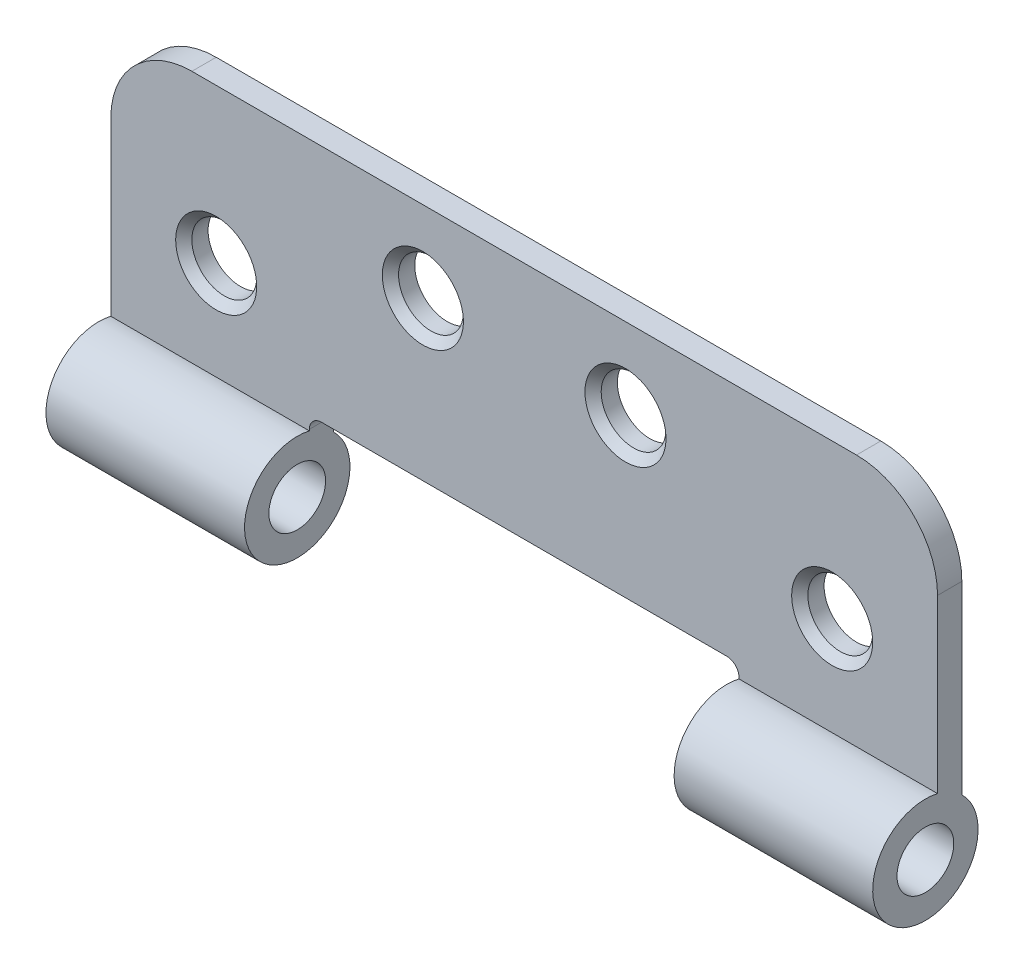
ISO-10303-21;
HEADER;
FILE_DESCRIPTION(('STEP AP214'),'2;1');
FILE_NAME('part.step','',(''),(''),'','','');
FILE_SCHEMA(('AUTOMOTIVE_DESIGN { 1 0 10303 214 1 1 1 1 }'));
ENDSEC;
DATA;
#1=APPLICATION_CONTEXT('core data for automotive mechanical design processes');
#2=APPLICATION_PROTOCOL_DEFINITION('international standard','automotive_design',2000,#1);
#3=PRODUCT_CONTEXT('',#1,'mechanical');
#4=PRODUCT('Part','Part','',(#3));
#5=PRODUCT_RELATED_PRODUCT_CATEGORY('part','',(#4));
#6=PRODUCT_DEFINITION_FORMATION('','',#4);
#7=PRODUCT_DEFINITION_CONTEXT('part definition',#1,'design');
#8=PRODUCT_DEFINITION('design','',#6,#7);
#9=PRODUCT_DEFINITION_SHAPE('','',#8);
#10=(LENGTH_UNIT() NAMED_UNIT(*) SI_UNIT(.MILLI.,.METRE.));
#11=(NAMED_UNIT(*) PLANE_ANGLE_UNIT() SI_UNIT($,.RADIAN.));
#12=(NAMED_UNIT(*) SI_UNIT($,.STERADIAN.) SOLID_ANGLE_UNIT());
#13=UNCERTAINTY_MEASURE_WITH_UNIT(LENGTH_MEASURE(1.E-05),#10,'distance_accuracy_value','');
#14=(GEOMETRIC_REPRESENTATION_CONTEXT(3) GLOBAL_UNCERTAINTY_ASSIGNED_CONTEXT((#13)) GLOBAL_UNIT_ASSIGNED_CONTEXT((#10,
#11,#12)) REPRESENTATION_CONTEXT('',''));
#15=CARTESIAN_POINT('',(0.,0.,0.));
#16=DIRECTION('',(0.,0.,1.));
#17=DIRECTION('',(1.,0.,0.));
#18=AXIS2_PLACEMENT_3D('',#15,#16,#17);
#19=CARTESIAN_POINT('',(69.3847763108502,0.,4.5));
#20=DIRECTION('',(-1.,0.,0.));
#21=DIRECTION('',(0.,0.,1.));
#22=AXIS2_PLACEMENT_3D('',#19,#20,#21);
#23=CYLINDRICAL_SURFACE('',#22,6.5);
#24=CARTESIAN_POINT('',(-26.5,0.,4.5));
#25=DIRECTION('',(-1.,0.,0.));
#26=DIRECTION('',(0.,-1.,0.));
#27=AXIS2_PLACEMENT_3D('',#24,#25,#26);
#28=CIRCLE('',#27,6.5);
#29=CARTESIAN_POINT('',(-26.5,6.32455532033676,3.));
#30=VERTEX_POINT('',#29);
#31=CARTESIAN_POINT('',(-26.5,4.69041575982343,0.));
#32=VERTEX_POINT('',#31);
#33=EDGE_CURVE('E529',#30,#32,#28,.F.);
#34=ORIENTED_EDGE('',*,*,#33,.F.);
#35=DIRECTION('',(-1.,0.,0.));
#36=VECTOR('',#35,1.);
#37=CARTESIAN_POINT('',(69.3847763108502,6.32455532033676,3.));
#38=LINE('',#37,#36);
#39=CARTESIAN_POINT('',(-51.,6.32455532033676,3.));
#40=VERTEX_POINT('',#39);
#41=EDGE_CURVE('E157',#40,#30,#38,.F.);
#42=ORIENTED_EDGE('',*,*,#41,.F.);
#43=CARTESIAN_POINT('',(-51.,0.,4.5));
#44=DIRECTION('',(-1.,0.,0.));
#45=DIRECTION('',(0.,0.,1.));
#46=AXIS2_PLACEMENT_3D('',#43,#44,#45);
#47=CIRCLE('',#46,6.5);
#48=CARTESIAN_POINT('',(-51.,4.69041575982343,0.));
#49=VERTEX_POINT('',#48);
#50=EDGE_CURVE('E541',#49,#40,#47,.T.);
#51=ORIENTED_EDGE('',*,*,#50,.F.);
#52=DIRECTION('',(-1.,0.,0.));
#53=VECTOR('',#52,1.);
#54=CARTESIAN_POINT('',(69.3847763108502,4.69041575982343,0.));
#55=LINE('',#54,#53);
#56=EDGE_CURVE('E158',#49,#32,#55,.F.);
#57=ORIENTED_EDGE('',*,*,#56,.T.);
#58=EDGE_LOOP('',(#34,#42,#51,#57));
#59=FACE_BOUND('',#58,.T.);
#60=ADVANCED_FACE('F40',(#59),#23,.T.);
#61=CARTESIAN_POINT('',(51.,0.,4.5));
#62=DIRECTION('',(-1.,0.,0.));
#63=DIRECTION('',(0.,0.,1.));
#64=AXIS2_PLACEMENT_3D('',#61,#62,#63);
#65=CYLINDRICAL_SURFACE('',#64,3.5);
#66=CARTESIAN_POINT('',(-26.5,0.,4.5));
#67=DIRECTION('',(-1.,0.,0.));
#68=DIRECTION('',(0.,-1.,0.));
#69=AXIS2_PLACEMENT_3D('',#66,#67,#68);
#70=CIRCLE('',#69,3.5);
#71=CARTESIAN_POINT('',(-26.5,-3.5,4.5));
#72=VERTEX_POINT('',#71);
#73=EDGE_CURVE('E143',#72,#72,#70,.F.);
#74=ORIENTED_EDGE('',*,*,#73,.T.);
#75=EDGE_LOOP('',(#74));
#76=FACE_BOUND('',#75,.T.);
#77=CARTESIAN_POINT('',(-51.,0.,4.5));
#78=DIRECTION('',(-1.,0.,0.));
#79=DIRECTION('',(0.,0.,1.));
#80=AXIS2_PLACEMENT_3D('',#77,#78,#79);
#81=CIRCLE('',#80,3.5);
#82=CARTESIAN_POINT('',(-51.,0.,8.));
#83=VERTEX_POINT('',#82);
#84=EDGE_CURVE('E537',#83,#83,#81,.T.);
#85=ORIENTED_EDGE('',*,*,#84,.T.);
#86=EDGE_LOOP('',(#85));
#87=FACE_BOUND('',#86,.T.);
#88=ADVANCED_FACE('F272',(#76,#87),#65,.F.);
#89=CARTESIAN_POINT('',(-41.,27.5,3.));
#90=DIRECTION('',(0.,0.,-1.));
#91=DIRECTION('',(-1.,0.,0.));
#92=AXIS2_PLACEMENT_3D('',#89,#90,#91);
#93=PLANE('',#92);
#94=CARTESIAN_POINT('',(38.,18.5,3.));
#95=DIRECTION('',(0.,0.,-1.));
#96=DIRECTION('',(-1.,0.,0.));
#97=AXIS2_PLACEMENT_3D('',#94,#95,#96);
#98=CIRCLE('',#97,5.00000000000003);
#99=CARTESIAN_POINT('',(33.,18.5,3.));
#100=VERTEX_POINT('',#99);
#101=EDGE_CURVE('E246',#100,#100,#98,.T.);
#102=ORIENTED_EDGE('',*,*,#101,.T.);
#103=EDGE_LOOP('',(#102));
#104=FACE_BOUND('',#103,.T.);
#105=CARTESIAN_POINT('',(12.5,27.5,3.));
#106=DIRECTION('',(0.,0.,-1.));
#107=DIRECTION('',(-1.,0.,0.));
#108=AXIS2_PLACEMENT_3D('',#105,#106,#107);
#109=CIRCLE('',#108,5.00000000000002);
#110=CARTESIAN_POINT('',(7.49999999999999,27.5,3.));
#111=VERTEX_POINT('',#110);
#112=EDGE_CURVE('E243',#111,#111,#109,.T.);
#113=ORIENTED_EDGE('',*,*,#112,.T.);
#114=EDGE_LOOP('',(#113));
#115=FACE_BOUND('',#114,.T.);
#116=CARTESIAN_POINT('',(-12.5,27.5,3.));
#117=DIRECTION('',(0.,0.,-1.));
#118=DIRECTION('',(-1.,0.,0.));
#119=AXIS2_PLACEMENT_3D('',#116,#117,#118);
#120=CIRCLE('',#119,5.00000000000003);
#121=CARTESIAN_POINT('',(-17.5,27.5,3.));
#122=VERTEX_POINT('',#121);
#123=EDGE_CURVE('E240',#122,#122,#120,.T.);
#124=ORIENTED_EDGE('',*,*,#123,.T.);
#125=EDGE_LOOP('',(#124));
#126=FACE_BOUND('',#125,.T.);
#127=CARTESIAN_POINT('',(-38.,18.5,3.));
#128=DIRECTION('',(0.,0.,-1.));
#129=DIRECTION('',(-1.,0.,0.));
#130=AXIS2_PLACEMENT_3D('',#127,#128,#129);
#131=CIRCLE('',#130,5.00000000000002);
#132=CARTESIAN_POINT('',(-43.,18.5,3.));
#133=VERTEX_POINT('',#132);
#134=EDGE_CURVE('E237',#133,#133,#131,.T.);
#135=ORIENTED_EDGE('',*,*,#134,.T.);
#136=EDGE_LOOP('',(#135));
#137=FACE_BOUND('',#136,.T.);
#138=ORIENTED_EDGE('',*,*,#41,.T.);
#139=DIRECTION('',(0.,1.,0.));
#140=VECTOR('',#139,1.);
#141=CARTESIAN_POINT('',(-26.5,27.5,3.));
#142=LINE('',#141,#140);
#143=CARTESIAN_POINT('',(-26.5,6.5,3.));
#144=VERTEX_POINT('',#143);
#145=EDGE_CURVE('E217',#30,#144,#142,.T.);
#146=ORIENTED_EDGE('',*,*,#145,.T.);
#147=CARTESIAN_POINT('',(-25.,6.5,3.));
#148=DIRECTION('',(0.,0.,-1.));
#149=DIRECTION('',(-1.,0.,0.));
#150=AXIS2_PLACEMENT_3D('',#147,#148,#149);
#151=CIRCLE('',#150,1.5);
#152=CARTESIAN_POINT('',(-25.,8.,3.));
#153=VERTEX_POINT('',#152);
#154=EDGE_CURVE('E56',#144,#153,#151,.T.);
#155=ORIENTED_EDGE('',*,*,#154,.T.);
#156=DIRECTION('',(1.,0.,0.));
#157=VECTOR('',#156,1.);
#158=CARTESIAN_POINT('',(-41.,8.,3.));
#159=LINE('',#158,#157);
#160=CARTESIAN_POINT('',(25.,8.,3.));
#161=VERTEX_POINT('',#160);
#162=EDGE_CURVE('E535',#153,#161,#159,.T.);
#163=ORIENTED_EDGE('',*,*,#162,.T.);
#164=CARTESIAN_POINT('',(25.,6.5,3.));
#165=DIRECTION('',(0.,0.,-1.));
#166=DIRECTION('',(-1.,0.,0.));
#167=AXIS2_PLACEMENT_3D('',#164,#165,#166);
#168=CIRCLE('',#167,1.5);
#169=CARTESIAN_POINT('',(26.5,6.5,3.));
#170=VERTEX_POINT('',#169);
#171=EDGE_CURVE('E140',#161,#170,#168,.T.);
#172=ORIENTED_EDGE('',*,*,#171,.T.);
#173=DIRECTION('',(0.,-1.,0.));
#174=VECTOR('',#173,1.);
#175=CARTESIAN_POINT('',(26.5,27.5,3.));
#176=LINE('',#175,#174);
#177=CARTESIAN_POINT('',(26.5,6.32455532033676,3.));
#178=VERTEX_POINT('',#177);
#179=EDGE_CURVE('E132',#170,#178,#176,.T.);
#180=ORIENTED_EDGE('',*,*,#179,.T.);
#181=CARTESIAN_POINT('',(51.,6.32455532033676,3.));
#182=VERTEX_POINT('',#181);
#183=EDGE_CURVE('E137',#178,#182,#38,.F.);
#184=ORIENTED_EDGE('',*,*,#183,.T.);
#185=DIRECTION('',(0.,1.,0.));
#186=VECTOR('',#185,1.);
#187=CARTESIAN_POINT('',(51.,0.,3.));
#188=LINE('',#187,#186);
#189=CARTESIAN_POINT('',(51.,27.4999999999999,3.));
#190=VERTEX_POINT('',#189);
#191=EDGE_CURVE('E181',#182,#190,#188,.T.);
#192=ORIENTED_EDGE('',*,*,#191,.T.);
#193=CARTESIAN_POINT('',(41.,27.5,3.));
#194=DIRECTION('',(0.,0.,1.));
#195=DIRECTION('',(-1.,0.,0.));
#196=AXIS2_PLACEMENT_3D('',#193,#194,#195);
#197=CIRCLE('',#196,10.);
#198=CARTESIAN_POINT('',(40.9999999999999,37.5,3.));
#199=VERTEX_POINT('',#198);
#200=EDGE_CURVE('E184',#190,#199,#197,.T.);
#201=ORIENTED_EDGE('',*,*,#200,.T.);
#202=DIRECTION('',(-1.,0.,0.));
#203=VECTOR('',#202,1.);
#204=CARTESIAN_POINT('',(-40.9999999999999,37.5,3.));
#205=LINE('',#204,#203);
#206=CARTESIAN_POINT('',(-40.9999999999999,37.5,3.));
#207=VERTEX_POINT('',#206);
#208=EDGE_CURVE('E186',#199,#207,#205,.T.);
#209=ORIENTED_EDGE('',*,*,#208,.T.);
#210=CARTESIAN_POINT('',(-41.,27.5,3.));
#211=DIRECTION('',(0.,0.,1.));
#212=DIRECTION('',(-1.,0.,0.));
#213=AXIS2_PLACEMENT_3D('',#210,#211,#212);
#214=CIRCLE('',#213,10.);
#215=CARTESIAN_POINT('',(-51.,27.4999999999999,3.));
#216=VERTEX_POINT('',#215);
#217=EDGE_CURVE('E188',#207,#216,#214,.T.);
#218=ORIENTED_EDGE('',*,*,#217,.T.);
#219=DIRECTION('',(0.,-1.,0.));
#220=VECTOR('',#219,1.);
#221=CARTESIAN_POINT('',(-51.,0.,3.));
#222=LINE('',#221,#220);
#223=EDGE_CURVE('E178',#216,#40,#222,.T.);
#224=ORIENTED_EDGE('',*,*,#223,.T.);
#225=EDGE_LOOP('',(#138,#146,#155,#163,#172,#180,#184,#192,#201,#209,#218,#224));
#226=FACE_BOUND('',#225,.T.);
#227=ADVANCED_FACE('F135',(#104,#115,#126,#137,#226),#93,.F.);
#228=CARTESIAN_POINT('',(-41.,27.5,0.));
#229=DIRECTION('',(0.,0.,-1.));
#230=DIRECTION('',(-1.,0.,0.));
#231=AXIS2_PLACEMENT_3D('',#228,#229,#230);
#232=PLANE('',#231);
#233=DIRECTION('',(0.,1.,0.));
#234=VECTOR('',#233,1.);
#235=CARTESIAN_POINT('',(-26.5,27.5,0.));
#236=LINE('',#235,#234);
#237=CARTESIAN_POINT('',(-26.5,6.5,0.));
#238=VERTEX_POINT('',#237);
#239=EDGE_CURVE('E531',#32,#238,#236,.T.);
#240=ORIENTED_EDGE('',*,*,#239,.F.);
#241=ORIENTED_EDGE('',*,*,#56,.F.);
#242=DIRECTION('',(0.,-1.,0.));
#243=VECTOR('',#242,1.);
#244=CARTESIAN_POINT('',(-51.,0.,0.));
#245=LINE('',#244,#243);
#246=CARTESIAN_POINT('',(-51.,27.4999999999999,0.));
#247=VERTEX_POINT('',#246);
#248=EDGE_CURVE('E177',#247,#49,#245,.T.);
#249=ORIENTED_EDGE('',*,*,#248,.F.);
#250=CARTESIAN_POINT('',(-41.,27.5,0.));
#251=DIRECTION('',(0.,0.,1.));
#252=DIRECTION('',(-1.,0.,0.));
#253=AXIS2_PLACEMENT_3D('',#250,#251,#252);
#254=CIRCLE('',#253,10.);
#255=CARTESIAN_POINT('',(-40.9999999999999,37.5,0.));
#256=VERTEX_POINT('',#255);
#257=EDGE_CURVE('E182',#256,#247,#254,.T.);
#258=ORIENTED_EDGE('',*,*,#257,.F.);
#259=DIRECTION('',(-1.,0.,0.));
#260=VECTOR('',#259,1.);
#261=CARTESIAN_POINT('',(-40.9999999999999,37.5,0.));
#262=LINE('',#261,#260);
#263=CARTESIAN_POINT('',(40.9999999999999,37.5,0.));
#264=VERTEX_POINT('',#263);
#265=EDGE_CURVE('E197',#264,#256,#262,.T.);
#266=ORIENTED_EDGE('',*,*,#265,.F.);
#267=CARTESIAN_POINT('',(41.,27.5,0.));
#268=DIRECTION('',(0.,0.,1.));
#269=DIRECTION('',(-1.,0.,0.));
#270=AXIS2_PLACEMENT_3D('',#267,#268,#269);
#271=CIRCLE('',#270,10.);
#272=CARTESIAN_POINT('',(51.,27.4999999999999,0.));
#273=VERTEX_POINT('',#272);
#274=EDGE_CURVE('E195',#273,#264,#271,.T.);
#275=ORIENTED_EDGE('',*,*,#274,.F.);
#276=DIRECTION('',(0.,1.,0.));
#277=VECTOR('',#276,1.);
#278=CARTESIAN_POINT('',(51.,0.,0.));
#279=LINE('',#278,#277);
#280=CARTESIAN_POINT('',(51.,4.69041575982343,0.));
#281=VERTEX_POINT('',#280);
#282=EDGE_CURVE('E193',#281,#273,#279,.T.);
#283=ORIENTED_EDGE('',*,*,#282,.F.);
#284=CARTESIAN_POINT('',(26.5,4.69041575982343,0.));
#285=VERTEX_POINT('',#284);
#286=EDGE_CURVE('E162',#285,#281,#55,.F.);
#287=ORIENTED_EDGE('',*,*,#286,.F.);
#288=DIRECTION('',(0.,-1.,0.));
#289=VECTOR('',#288,1.);
#290=CARTESIAN_POINT('',(26.5,27.5,0.));
#291=LINE('',#290,#289);
#292=CARTESIAN_POINT('',(26.5,6.5,0.));
#293=VERTEX_POINT('',#292);
#294=EDGE_CURVE('E149',#293,#285,#291,.T.);
#295=ORIENTED_EDGE('',*,*,#294,.F.);
#296=CARTESIAN_POINT('',(25.,6.5,0.));
#297=DIRECTION('',(0.,0.,-1.));
#298=DIRECTION('',(-1.,0.,0.));
#299=AXIS2_PLACEMENT_3D('',#296,#297,#298);
#300=CIRCLE('',#299,1.5);
#301=CARTESIAN_POINT('',(25.,8.,0.));
#302=VERTEX_POINT('',#301);
#303=EDGE_CURVE('E230',#293,#302,#300,.F.);
#304=ORIENTED_EDGE('',*,*,#303,.T.);
#305=DIRECTION('',(1.,0.,0.));
#306=VECTOR('',#305,1.);
#307=CARTESIAN_POINT('',(-41.,8.,0.));
#308=LINE('',#307,#306);
#309=CARTESIAN_POINT('',(-25.,8.,0.));
#310=VERTEX_POINT('',#309);
#311=EDGE_CURVE('E211',#310,#302,#308,.T.);
#312=ORIENTED_EDGE('',*,*,#311,.F.);
#313=CARTESIAN_POINT('',(-25.,6.5,0.));
#314=DIRECTION('',(0.,0.,-1.));
#315=DIRECTION('',(-1.,0.,0.));
#316=AXIS2_PLACEMENT_3D('',#313,#314,#315);
#317=CIRCLE('',#316,1.5);
#318=EDGE_CURVE('E64',#310,#238,#317,.F.);
#319=ORIENTED_EDGE('',*,*,#318,.T.);
#320=EDGE_LOOP('',(#240,#241,#249,#258,#266,#275,#283,#287,#295,#304,#312,#319));
#321=FACE_BOUND('',#320,.T.);
#322=CARTESIAN_POINT('',(-12.5,27.5,0.));
#323=DIRECTION('',(0.,0.,1.));
#324=DIRECTION('',(1.,0.,0.));
#325=AXIS2_PLACEMENT_3D('',#322,#323,#324);
#326=CIRCLE('',#325,4.);
#327=CARTESIAN_POINT('',(-8.49999999999999,27.5,0.));
#328=VERTEX_POINT('',#327);
#329=EDGE_CURVE('E168',#328,#328,#326,.T.);
#330=ORIENTED_EDGE('',*,*,#329,.T.);
#331=EDGE_LOOP('',(#330));
#332=FACE_BOUND('',#331,.T.);
#333=CARTESIAN_POINT('',(-38.,18.5,0.));
#334=DIRECTION('',(0.,0.,1.));
#335=DIRECTION('',(1.,0.,0.));
#336=AXIS2_PLACEMENT_3D('',#333,#334,#335);
#337=CIRCLE('',#336,4.00000000000001);
#338=CARTESIAN_POINT('',(-34.,18.5,0.));
#339=VERTEX_POINT('',#338);
#340=EDGE_CURVE('E174',#339,#339,#337,.T.);
#341=ORIENTED_EDGE('',*,*,#340,.T.);
#342=EDGE_LOOP('',(#341));
#343=FACE_BOUND('',#342,.T.);
#344=CARTESIAN_POINT('',(38.,18.5,0.));
#345=DIRECTION('',(0.,0.,1.));
#346=DIRECTION('',(1.,0.,0.));
#347=AXIS2_PLACEMENT_3D('',#344,#345,#346);
#348=CIRCLE('',#347,4.00000000000001);
#349=CARTESIAN_POINT('',(42.,18.5,0.));
#350=VERTEX_POINT('',#349);
#351=EDGE_CURVE('E171',#350,#350,#348,.T.);
#352=ORIENTED_EDGE('',*,*,#351,.T.);
#353=EDGE_LOOP('',(#352));
#354=FACE_BOUND('',#353,.T.);
#355=CARTESIAN_POINT('',(12.5,27.5,0.));
#356=DIRECTION('',(0.,0.,1.));
#357=DIRECTION('',(1.,0.,0.));
#358=AXIS2_PLACEMENT_3D('',#355,#356,#357);
#359=CIRCLE('',#358,4.);
#360=CARTESIAN_POINT('',(16.5,27.5,0.));
#361=VERTEX_POINT('',#360);
#362=EDGE_CURVE('E160',#361,#361,#359,.T.);
#363=ORIENTED_EDGE('',*,*,#362,.T.);
#364=EDGE_LOOP('',(#363));
#365=FACE_BOUND('',#364,.T.);
#366=ADVANCED_FACE('F308',(#321,#332,#343,#354,#365),#232,.T.);
#367=CARTESIAN_POINT('',(-51.,0.,3.));
#368=DIRECTION('',(1.,0.,0.));
#369=DIRECTION('',(0.,0.,-1.));
#370=AXIS2_PLACEMENT_3D('',#367,#368,#369);
#371=PLANE('',#370);
#372=ORIENTED_EDGE('',*,*,#84,.F.);
#373=EDGE_LOOP('',(#372));
#374=FACE_BOUND('',#373,.T.);
#375=ORIENTED_EDGE('',*,*,#50,.T.);
#376=ORIENTED_EDGE('',*,*,#223,.F.);
#377=DIRECTION('',(0.,0.,-1.));
#378=VECTOR('',#377,1.);
#379=CARTESIAN_POINT('',(-51.,27.4999999999999,3.));
#380=LINE('',#379,#378);
#381=EDGE_CURVE('E190',#216,#247,#380,.T.);
#382=ORIENTED_EDGE('',*,*,#381,.T.);
#383=ORIENTED_EDGE('',*,*,#248,.T.);
#384=EDGE_LOOP('',(#375,#376,#382,#383));
#385=FACE_BOUND('',#384,.T.);
#386=ADVANCED_FACE('F312',(#374,#385),#371,.F.);
#387=CARTESIAN_POINT('',(51.,0.,3.));
#388=DIRECTION('',(-1.,0.,0.));
#389=DIRECTION('',(0.,0.,1.));
#390=AXIS2_PLACEMENT_3D('',#387,#388,#389);
#391=PLANE('',#390);
#392=CARTESIAN_POINT('',(51.,0.,4.5));
#393=DIRECTION('',(-1.,0.,0.));
#394=DIRECTION('',(0.,0.,1.));
#395=AXIS2_PLACEMENT_3D('',#392,#393,#394);
#396=CIRCLE('',#395,3.5);
#397=CARTESIAN_POINT('',(51.,0.,8.));
#398=VERTEX_POINT('',#397);
#399=EDGE_CURVE('E538',#398,#398,#396,.T.);
#400=ORIENTED_EDGE('',*,*,#399,.T.);
#401=EDGE_LOOP('',(#400));
#402=FACE_BOUND('',#401,.T.);
#403=ORIENTED_EDGE('',*,*,#191,.F.);
#404=CARTESIAN_POINT('',(51.,0.,4.5));
#405=DIRECTION('',(-1.,0.,0.));
#406=DIRECTION('',(0.,0.,1.));
#407=AXIS2_PLACEMENT_3D('',#404,#405,#406);
#408=CIRCLE('',#407,6.5);
#409=EDGE_CURVE('E155',#182,#281,#408,.F.);
#410=ORIENTED_EDGE('',*,*,#409,.T.);
#411=ORIENTED_EDGE('',*,*,#282,.T.);
#412=DIRECTION('',(0.,0.,-1.));
#413=VECTOR('',#412,1.);
#414=CARTESIAN_POINT('',(51.,27.4999999999999,3.));
#415=LINE('',#414,#413);
#416=EDGE_CURVE('E208',#190,#273,#415,.T.);
#417=ORIENTED_EDGE('',*,*,#416,.F.);
#418=EDGE_LOOP('',(#403,#410,#411,#417));
#419=FACE_BOUND('',#418,.T.);
#420=ADVANCED_FACE('F323',(#402,#419),#391,.F.);
#421=CARTESIAN_POINT('',(41.,27.5,3.));
#422=DIRECTION('',(0.,0.,-1.));
#423=DIRECTION('',(-1.,0.,0.));
#424=AXIS2_PLACEMENT_3D('',#421,#422,#423);
#425=CYLINDRICAL_SURFACE('',#424,10.);
#426=ORIENTED_EDGE('',*,*,#274,.T.);
#427=DIRECTION('',(0.,0.,-1.));
#428=VECTOR('',#427,1.);
#429=CARTESIAN_POINT('',(40.9999999999999,37.5,3.));
#430=LINE('',#429,#428);
#431=EDGE_CURVE('E205',#199,#264,#430,.T.);
#432=ORIENTED_EDGE('',*,*,#431,.F.);
#433=ORIENTED_EDGE('',*,*,#200,.F.);
#434=ORIENTED_EDGE('',*,*,#416,.T.);
#435=EDGE_LOOP('',(#426,#432,#433,#434));
#436=FACE_BOUND('',#435,.T.);
#437=ADVANCED_FACE('F319',(#436),#425,.T.);
#438=CARTESIAN_POINT('',(-40.9999999999999,37.5,3.));
#439=DIRECTION('',(0.,-1.,0.));
#440=DIRECTION('',(0.,0.,-1.));
#441=AXIS2_PLACEMENT_3D('',#438,#439,#440);
#442=PLANE('',#441);
#443=ORIENTED_EDGE('',*,*,#265,.T.);
#444=DIRECTION('',(0.,0.,-1.));
#445=VECTOR('',#444,1.);
#446=CARTESIAN_POINT('',(-40.9999999999999,37.5,3.));
#447=LINE('',#446,#445);
#448=EDGE_CURVE('E202',#207,#256,#447,.T.);
#449=ORIENTED_EDGE('',*,*,#448,.F.);
#450=ORIENTED_EDGE('',*,*,#208,.F.);
#451=ORIENTED_EDGE('',*,*,#431,.T.);
#452=EDGE_LOOP('',(#443,#449,#450,#451));
#453=FACE_BOUND('',#452,.T.);
#454=ADVANCED_FACE('F315',(#453),#442,.F.);
#455=CARTESIAN_POINT('',(-41.,27.5,3.));
#456=DIRECTION('',(0.,0.,-1.));
#457=DIRECTION('',(-1.,0.,0.));
#458=AXIS2_PLACEMENT_3D('',#455,#456,#457);
#459=CYLINDRICAL_SURFACE('',#458,10.);
#460=ORIENTED_EDGE('',*,*,#257,.T.);
#461=ORIENTED_EDGE('',*,*,#381,.F.);
#462=ORIENTED_EDGE('',*,*,#217,.F.);
#463=ORIENTED_EDGE('',*,*,#448,.T.);
#464=EDGE_LOOP('',(#460,#461,#462,#463));
#465=FACE_BOUND('',#464,.T.);
#466=ADVANCED_FACE('F304',(#465),#459,.T.);
#467=CARTESIAN_POINT('',(-38.,18.5,3.));
#468=DIRECTION('',(0.,0.,-1.));
#469=DIRECTION('',(-1.,0.,0.));
#470=AXIS2_PLACEMENT_3D('',#467,#468,#469);
#471=CYLINDRICAL_SURFACE('',#470,4.00000000000001);
#472=CARTESIAN_POINT('',(-38.,18.5,2.));
#473=DIRECTION('',(0.,0.,-1.));
#474=DIRECTION('',(-1.,0.,0.));
#475=AXIS2_PLACEMENT_3D('',#472,#473,#474);
#476=CIRCLE('',#475,4.00000000000001);
#477=CARTESIAN_POINT('',(-42.,18.5,2.));
#478=VERTEX_POINT('',#477);
#479=EDGE_CURVE('E11',#478,#478,#476,.F.);
#480=ORIENTED_EDGE('',*,*,#479,.T.);
#481=EDGE_LOOP('',(#480));
#482=FACE_BOUND('',#481,.T.);
#483=ORIENTED_EDGE('',*,*,#340,.F.);
#484=EDGE_LOOP('',(#483));
#485=FACE_BOUND('',#484,.T.);
#486=ADVANCED_FACE('F300',(#482,#485),#471,.F.);
#487=CARTESIAN_POINT('',(38.,18.5,3.));
#488=DIRECTION('',(0.,0.,-1.));
#489=DIRECTION('',(-1.,0.,0.));
#490=AXIS2_PLACEMENT_3D('',#487,#488,#489);
#491=CYLINDRICAL_SURFACE('',#490,4.00000000000001);
#492=CARTESIAN_POINT('',(38.,18.5,1.99999999999999));
#493=DIRECTION('',(0.,0.,-1.));
#494=DIRECTION('',(-1.,0.,0.));
#495=AXIS2_PLACEMENT_3D('',#492,#493,#494);
#496=CIRCLE('',#495,4.00000000000001);
#497=CARTESIAN_POINT('',(34.,18.5,1.99999999999999));
#498=VERTEX_POINT('',#497);
#499=EDGE_CURVE('E234',#498,#498,#496,.F.);
#500=ORIENTED_EDGE('',*,*,#499,.T.);
#501=EDGE_LOOP('',(#500));
#502=FACE_BOUND('',#501,.T.);
#503=ORIENTED_EDGE('',*,*,#351,.F.);
#504=EDGE_LOOP('',(#503));
#505=FACE_BOUND('',#504,.T.);
#506=ADVANCED_FACE('F294',(#502,#505),#491,.F.);
#507=CARTESIAN_POINT('',(-12.5,27.5,3.));
#508=DIRECTION('',(0.,0.,-1.));
#509=DIRECTION('',(-1.,0.,0.));
#510=AXIS2_PLACEMENT_3D('',#507,#508,#509);
#511=CYLINDRICAL_SURFACE('',#510,4.);
#512=CARTESIAN_POINT('',(-12.5,27.5,1.99999999999998));
#513=DIRECTION('',(0.,0.,-1.));
#514=DIRECTION('',(-1.,0.,0.));
#515=AXIS2_PLACEMENT_3D('',#512,#513,#514);
#516=CIRCLE('',#515,4.);
#517=CARTESIAN_POINT('',(-16.5,27.5,1.99999999999998));
#518=VERTEX_POINT('',#517);
#519=EDGE_CURVE('E49',#518,#518,#516,.F.);
#520=ORIENTED_EDGE('',*,*,#519,.T.);
#521=EDGE_LOOP('',(#520));
#522=FACE_BOUND('',#521,.T.);
#523=ORIENTED_EDGE('',*,*,#329,.F.);
#524=EDGE_LOOP('',(#523));
#525=FACE_BOUND('',#524,.T.);
#526=ADVANCED_FACE('F254',(#522,#525),#511,.F.);
#527=CARTESIAN_POINT('',(12.5,27.5,3.));
#528=DIRECTION('',(0.,0.,-1.));
#529=DIRECTION('',(-1.,0.,0.));
#530=AXIS2_PLACEMENT_3D('',#527,#528,#529);
#531=CYLINDRICAL_SURFACE('',#530,4.);
#532=CARTESIAN_POINT('',(12.5,27.5,2.));
#533=DIRECTION('',(0.,0.,-1.));
#534=DIRECTION('',(-1.,0.,0.));
#535=AXIS2_PLACEMENT_3D('',#532,#533,#534);
#536=CIRCLE('',#535,4.);
#537=CARTESIAN_POINT('',(8.5,27.5,2.));
#538=VERTEX_POINT('',#537);
#539=EDGE_CURVE('E249',#538,#538,#536,.F.);
#540=ORIENTED_EDGE('',*,*,#539,.T.);
#541=EDGE_LOOP('',(#540));
#542=FACE_BOUND('',#541,.T.);
#543=ORIENTED_EDGE('',*,*,#362,.F.);
#544=EDGE_LOOP('',(#543));
#545=FACE_BOUND('',#544,.T.);
#546=ADVANCED_FACE('F283',(#542,#545),#531,.F.);
#547=CARTESIAN_POINT('',(26.5,0.,4.5));
#548=DIRECTION('',(1.,0.,0.));
#549=DIRECTION('',(0.,1.,0.));
#550=AXIS2_PLACEMENT_3D('',#547,#548,#549);
#551=CIRCLE('',#550,6.5);
#552=EDGE_CURVE('E144',#285,#178,#551,.F.);
#553=ORIENTED_EDGE('',*,*,#552,.F.);
#554=ORIENTED_EDGE('',*,*,#286,.T.);
#555=ORIENTED_EDGE('',*,*,#409,.F.);
#556=ORIENTED_EDGE('',*,*,#183,.F.);
#557=EDGE_LOOP('',(#553,#554,#555,#556));
#558=FACE_BOUND('',#557,.T.);
#559=ADVANCED_FACE('F153',(#558),#23,.T.);
#560=CARTESIAN_POINT('',(26.5,0.,4.5));
#561=DIRECTION('',(1.,0.,0.));
#562=DIRECTION('',(0.,1.,0.));
#563=AXIS2_PLACEMENT_3D('',#560,#561,#562);
#564=CIRCLE('',#563,3.5);
#565=CARTESIAN_POINT('',(26.5,3.5,4.5));
#566=VERTEX_POINT('',#565);
#567=EDGE_CURVE('E212',#566,#566,#564,.F.);
#568=ORIENTED_EDGE('',*,*,#567,.T.);
#569=EDGE_LOOP('',(#568));
#570=FACE_BOUND('',#569,.T.);
#571=ORIENTED_EDGE('',*,*,#399,.F.);
#572=EDGE_LOOP('',(#571));
#573=FACE_BOUND('',#572,.T.);
#574=ADVANCED_FACE('F280',(#570,#573),#65,.F.);
#575=CARTESIAN_POINT('',(-26.5,8.,-2.));
#576=DIRECTION('',(0.,1.,0.));
#577=DIRECTION('',(0.,0.,1.));
#578=AXIS2_PLACEMENT_3D('',#575,#576,#577);
#579=PLANE('',#578);
#580=ORIENTED_EDGE('',*,*,#311,.T.);
#581=DIRECTION('',(0.,0.,1.));
#582=VECTOR('',#581,1.);
#583=CARTESIAN_POINT('',(25.,8.,3.));
#584=LINE('',#583,#582);
#585=EDGE_CURVE('E222',#302,#161,#584,.T.);
#586=ORIENTED_EDGE('',*,*,#585,.T.);
#587=ORIENTED_EDGE('',*,*,#162,.F.);
#588=DIRECTION('',(0.,0.,1.));
#589=VECTOR('',#588,1.);
#590=CARTESIAN_POINT('',(-25.,8.,0.));
#591=LINE('',#590,#589);
#592=EDGE_CURVE('E220',#153,#310,#591,.F.);
#593=ORIENTED_EDGE('',*,*,#592,.T.);
#594=EDGE_LOOP('',(#580,#586,#587,#593));
#595=FACE_BOUND('',#594,.T.);
#596=ADVANCED_FACE('F288',(#595),#579,.F.);
#597=CARTESIAN_POINT('',(-26.5,8.,-2.));
#598=DIRECTION('',(-1.,0.,0.));
#599=DIRECTION('',(0.,-1.,0.));
#600=AXIS2_PLACEMENT_3D('',#597,#598,#599);
#601=PLANE('',#600);
#602=ORIENTED_EDGE('',*,*,#239,.T.);
#603=DIRECTION('',(0.,0.,1.));
#604=VECTOR('',#603,1.);
#605=CARTESIAN_POINT('',(-26.5,6.5,3.));
#606=LINE('',#605,#604);
#607=EDGE_CURVE('E227',#238,#144,#606,.T.);
#608=ORIENTED_EDGE('',*,*,#607,.T.);
#609=ORIENTED_EDGE('',*,*,#145,.F.);
#610=ORIENTED_EDGE('',*,*,#33,.T.);
#611=EDGE_LOOP('',(#602,#608,#609,#610));
#612=FACE_BOUND('',#611,.T.);
#613=ORIENTED_EDGE('',*,*,#73,.F.);
#614=EDGE_LOOP('',(#613));
#615=FACE_BOUND('',#614,.T.);
#616=ADVANCED_FACE('F410',(#612,#615),#601,.F.);
#617=CARTESIAN_POINT('',(26.5,8.,-2.));
#618=DIRECTION('',(1.,0.,0.));
#619=DIRECTION('',(0.,1.,0.));
#620=AXIS2_PLACEMENT_3D('',#617,#618,#619);
#621=PLANE('',#620);
#622=ORIENTED_EDGE('',*,*,#567,.F.);
#623=EDGE_LOOP('',(#622));
#624=FACE_BOUND('',#623,.T.);
#625=ORIENTED_EDGE('',*,*,#179,.F.);
#626=DIRECTION('',(0.,0.,1.));
#627=VECTOR('',#626,1.);
#628=CARTESIAN_POINT('',(26.5,6.5,0.));
#629=LINE('',#628,#627);
#630=EDGE_CURVE('E225',#170,#293,#629,.F.);
#631=ORIENTED_EDGE('',*,*,#630,.T.);
#632=ORIENTED_EDGE('',*,*,#294,.T.);
#633=ORIENTED_EDGE('',*,*,#552,.T.);
#634=EDGE_LOOP('',(#625,#631,#632,#633));
#635=FACE_BOUND('',#634,.T.);
#636=ADVANCED_FACE('F147',(#624,#635),#621,.F.);
#637=CARTESIAN_POINT('',(25.,6.5,-2.));
#638=DIRECTION('',(0.,0.,-1.));
#639=DIRECTION('',(-1.,0.,0.));
#640=AXIS2_PLACEMENT_3D('',#637,#638,#639);
#641=CYLINDRICAL_SURFACE('',#640,1.5);
#642=ORIENTED_EDGE('',*,*,#303,.F.);
#643=ORIENTED_EDGE('',*,*,#630,.F.);
#644=ORIENTED_EDGE('',*,*,#171,.F.);
#645=ORIENTED_EDGE('',*,*,#585,.F.);
#646=EDGE_LOOP('',(#642,#643,#644,#645));
#647=FACE_BOUND('',#646,.T.);
#648=ADVANCED_FACE('F331',(#647),#641,.F.);
#649=CARTESIAN_POINT('',(-25.,6.5,-2.));
#650=DIRECTION('',(0.,0.,-1.));
#651=DIRECTION('',(-1.,0.,0.));
#652=AXIS2_PLACEMENT_3D('',#649,#650,#651);
#653=CYLINDRICAL_SURFACE('',#652,1.5);
#654=ORIENTED_EDGE('',*,*,#318,.F.);
#655=ORIENTED_EDGE('',*,*,#592,.F.);
#656=ORIENTED_EDGE('',*,*,#154,.F.);
#657=ORIENTED_EDGE('',*,*,#607,.F.);
#658=EDGE_LOOP('',(#654,#655,#656,#657));
#659=FACE_BOUND('',#658,.T.);
#660=ADVANCED_FACE('F334',(#659),#653,.F.);
#661=CARTESIAN_POINT('',(38.,18.5,1.99999999999999));
#662=DIRECTION('',(0.,0.,1.));
#663=DIRECTION('',(1.,0.,0.));
#664=AXIS2_PLACEMENT_3D('',#661,#662,#663);
#665=CONICAL_SURFACE('',#664,4.00000000000001,0.785398163397455);
#666=ORIENTED_EDGE('',*,*,#101,.F.);
#667=EDGE_LOOP('',(#666));
#668=FACE_BOUND('',#667,.T.);
#669=ORIENTED_EDGE('',*,*,#499,.F.);
#670=EDGE_LOOP('',(#669));
#671=FACE_BOUND('',#670,.T.);
#672=ADVANCED_FACE('F266',(#668,#671),#665,.F.);
#673=CARTESIAN_POINT('',(12.5,27.5,2.));
#674=DIRECTION('',(0.,0.,1.));
#675=DIRECTION('',(1.,0.,0.));
#676=AXIS2_PLACEMENT_3D('',#673,#674,#675);
#677=CONICAL_SURFACE('',#676,4.,0.785398163397455);
#678=ORIENTED_EDGE('',*,*,#112,.F.);
#679=EDGE_LOOP('',(#678));
#680=FACE_BOUND('',#679,.T.);
#681=ORIENTED_EDGE('',*,*,#539,.F.);
#682=EDGE_LOOP('',(#681));
#683=FACE_BOUND('',#682,.T.);
#684=ADVANCED_FACE('F259',(#680,#683),#677,.F.);
#685=CARTESIAN_POINT('',(-12.5,27.5,1.99999999999998));
#686=DIRECTION('',(0.,0.,1.));
#687=DIRECTION('',(1.,0.,0.));
#688=AXIS2_PLACEMENT_3D('',#685,#686,#687);
#689=CONICAL_SURFACE('',#688,4.,0.785398163397456);
#690=ORIENTED_EDGE('',*,*,#123,.F.);
#691=EDGE_LOOP('',(#690));
#692=FACE_BOUND('',#691,.T.);
#693=ORIENTED_EDGE('',*,*,#519,.F.);
#694=EDGE_LOOP('',(#693));
#695=FACE_BOUND('',#694,.T.);
#696=ADVANCED_FACE('F257',(#692,#695),#689,.F.);
#697=CARTESIAN_POINT('',(-38.,18.5,2.));
#698=DIRECTION('',(0.,0.,1.));
#699=DIRECTION('',(1.,0.,0.));
#700=AXIS2_PLACEMENT_3D('',#697,#698,#699);
#701=CONICAL_SURFACE('',#700,4.00000000000001,0.785398163397455);
#702=ORIENTED_EDGE('',*,*,#134,.F.);
#703=EDGE_LOOP('',(#702));
#704=FACE_BOUND('',#703,.T.);
#705=ORIENTED_EDGE('',*,*,#479,.F.);
#706=EDGE_LOOP('',(#705));
#707=FACE_BOUND('',#706,.T.);
#708=ADVANCED_FACE('F43',(#704,#707),#701,.F.);
#709=CLOSED_SHELL('',(#60,#88,#227,#366,#386,#420,#437,#454,#466,#486,#506,#526,#546,#559,#574,
#596,#616,#636,#648,#660,#672,#684,#696,#708));
#710=MANIFOLD_SOLID_BREP('B2',#709);
#711=ADVANCED_BREP_SHAPE_REPRESENTATION('',(#18,#710),#14);
#712=SHAPE_DEFINITION_REPRESENTATION(#9,#711);
ENDSEC;
END-ISO-10303-21;
